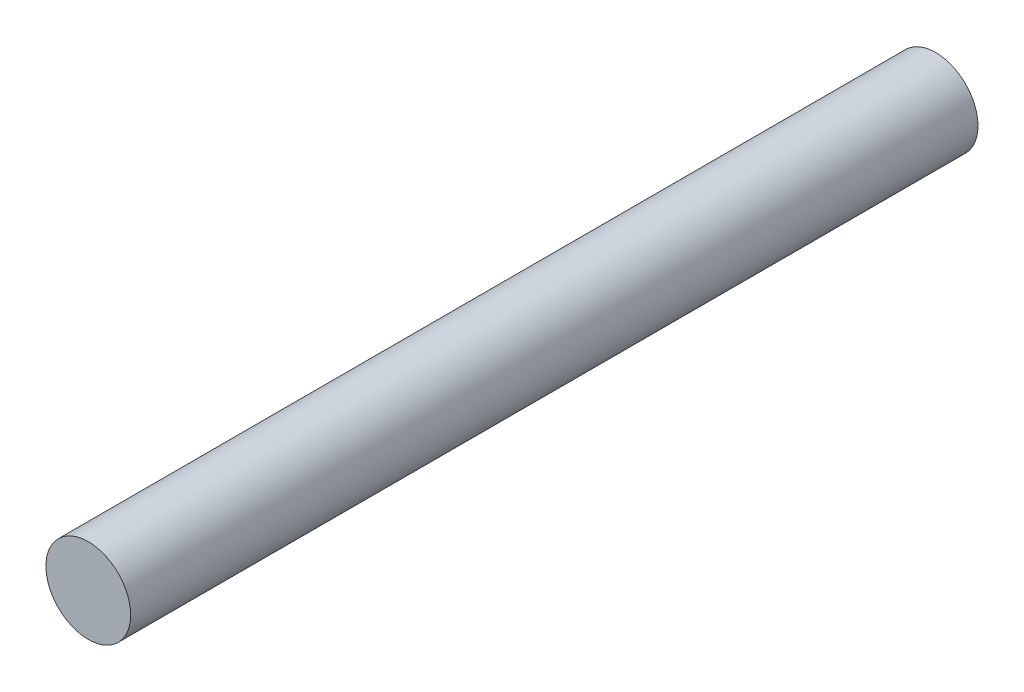
ISO-10303-21;
HEADER;
FILE_DESCRIPTION(('STEP AP214'),'2;1');
FILE_NAME('part.step','',(''),(''),'','','');
FILE_SCHEMA(('AUTOMOTIVE_DESIGN { 1 0 10303 214 1 1 1 1 }'));
ENDSEC;
DATA;
#1=APPLICATION_CONTEXT('core data for automotive mechanical design processes');
#2=APPLICATION_PROTOCOL_DEFINITION('international standard','automotive_design',2000,#1);
#3=PRODUCT_CONTEXT('',#1,'mechanical');
#4=PRODUCT('Part','Part','',(#3));
#5=PRODUCT_RELATED_PRODUCT_CATEGORY('part','',(#4));
#6=PRODUCT_DEFINITION_FORMATION('','',#4);
#7=PRODUCT_DEFINITION_CONTEXT('part definition',#1,'design');
#8=PRODUCT_DEFINITION('design','',#6,#7);
#9=PRODUCT_DEFINITION_SHAPE('','',#8);
#10=(LENGTH_UNIT() NAMED_UNIT(*) SI_UNIT(.MILLI.,.METRE.));
#11=(NAMED_UNIT(*) PLANE_ANGLE_UNIT() SI_UNIT($,.RADIAN.));
#12=(NAMED_UNIT(*) SI_UNIT($,.STERADIAN.) SOLID_ANGLE_UNIT());
#13=UNCERTAINTY_MEASURE_WITH_UNIT(LENGTH_MEASURE(1.E-05),#10,'distance_accuracy_value','');
#14=(GEOMETRIC_REPRESENTATION_CONTEXT(3) GLOBAL_UNCERTAINTY_ASSIGNED_CONTEXT((#13)) GLOBAL_UNIT_ASSIGNED_CONTEXT((#10,
#11,#12)) REPRESENTATION_CONTEXT('',''));
#15=CARTESIAN_POINT('',(0.,0.,0.));
#16=DIRECTION('',(0.,0.,1.));
#17=DIRECTION('',(1.,0.,0.));
#18=AXIS2_PLACEMENT_3D('',#15,#16,#17);
#19=CARTESIAN_POINT('',(7.33677889014635,4.,-4.60982505152292));
#20=DIRECTION('',(0.,0.,1.));
#21=DIRECTION('',(1.,0.,0.));
#22=AXIS2_PLACEMENT_3D('',#19,#20,#21);
#23=CYLINDRICAL_SURFACE('',#22,1.15);
#24=CARTESIAN_POINT('',(7.33677889014635,4.,11.4428661419352));
#25=DIRECTION('',(0.,0.,1.));
#26=DIRECTION('',(1.,0.,0.));
#27=AXIS2_PLACEMENT_3D('',#24,#25,#26);
#28=CIRCLE('',#27,1.15);
#29=CARTESIAN_POINT('',(8.48677889014635,4.,11.4428661419352));
#30=VERTEX_POINT('',#29);
#31=EDGE_CURVE('E10',#30,#30,#28,.T.);
#32=ORIENTED_EDGE('',*,*,#31,.F.);
#33=EDGE_LOOP('',(#32));
#34=FACE_BOUND('',#33,.T.);
#35=CARTESIAN_POINT('',(7.33677889014634,4.,-11.5571338580648));
#36=DIRECTION('',(0.,0.,1.));
#37=DIRECTION('',(1.,0.,0.));
#38=AXIS2_PLACEMENT_3D('',#35,#36,#37);
#39=CIRCLE('',#38,1.15);
#40=CARTESIAN_POINT('',(8.48677889014634,4.,-11.5571338580648));
#41=VERTEX_POINT('',#40);
#42=EDGE_CURVE('E46',#41,#41,#39,.T.);
#43=ORIENTED_EDGE('',*,*,#42,.T.);
#44=EDGE_LOOP('',(#43));
#45=FACE_BOUND('',#44,.T.);
#46=ADVANCED_FACE('F40',(#34,#45),#23,.T.);
#47=CARTESIAN_POINT('',(7.33677889014635,4.,11.4428661419352));
#48=DIRECTION('',(0.,0.,1.));
#49=DIRECTION('',(1.,0.,0.));
#50=AXIS2_PLACEMENT_3D('',#47,#48,#49);
#51=PLANE('',#50);
#52=ORIENTED_EDGE('',*,*,#31,.T.);
#53=EDGE_LOOP('',(#52));
#54=FACE_BOUND('',#53,.T.);
#55=ADVANCED_FACE('F55',(#54),#51,.T.);
#56=CARTESIAN_POINT('',(7.33677889014635,4.,-11.5571338580648));
#57=DIRECTION('',(0.,0.,1.));
#58=DIRECTION('',(1.,0.,0.));
#59=AXIS2_PLACEMENT_3D('',#56,#57,#58);
#60=PLANE('',#59);
#61=ORIENTED_EDGE('',*,*,#42,.F.);
#62=EDGE_LOOP('',(#61));
#63=FACE_BOUND('',#62,.T.);
#64=ADVANCED_FACE('F53',(#63),#60,.F.);
#65=CLOSED_SHELL('',(#46,#55,#64));
#66=MANIFOLD_SOLID_BREP('B2',#65);
#67=ADVANCED_BREP_SHAPE_REPRESENTATION('',(#18,#66),#14);
#68=SHAPE_DEFINITION_REPRESENTATION(#9,#67);
ENDSEC;
END-ISO-10303-21;
